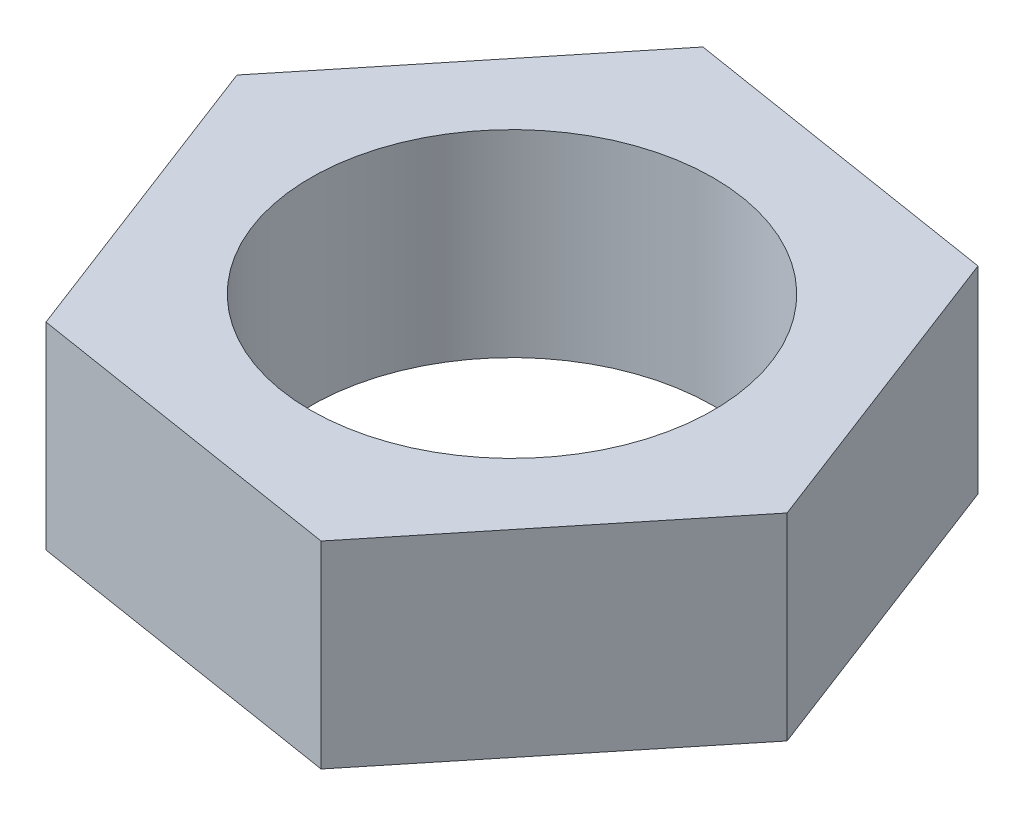
ISO-10303-21;
HEADER;
FILE_DESCRIPTION(('STEP AP214'),'2;1');
FILE_NAME('part.step','',(''),(''),'','','');
FILE_SCHEMA(('AUTOMOTIVE_DESIGN { 1 0 10303 214 1 1 1 1 }'));
ENDSEC;
DATA;
#1=APPLICATION_CONTEXT('core data for automotive mechanical design processes');
#2=APPLICATION_PROTOCOL_DEFINITION('international standard','automotive_design',2000,#1);
#3=PRODUCT_CONTEXT('',#1,'mechanical');
#4=PRODUCT('Part','Part','',(#3));
#5=PRODUCT_RELATED_PRODUCT_CATEGORY('part','',(#4));
#6=PRODUCT_DEFINITION_FORMATION('','',#4);
#7=PRODUCT_DEFINITION_CONTEXT('part definition',#1,'design');
#8=PRODUCT_DEFINITION('design','',#6,#7);
#9=PRODUCT_DEFINITION_SHAPE('','',#8);
#10=(LENGTH_UNIT() NAMED_UNIT(*) SI_UNIT(.MILLI.,.METRE.));
#11=(NAMED_UNIT(*) PLANE_ANGLE_UNIT() SI_UNIT($,.RADIAN.));
#12=(NAMED_UNIT(*) SI_UNIT($,.STERADIAN.) SOLID_ANGLE_UNIT());
#13=UNCERTAINTY_MEASURE_WITH_UNIT(LENGTH_MEASURE(1.E-05),#10,'distance_accuracy_value','');
#14=(GEOMETRIC_REPRESENTATION_CONTEXT(3) GLOBAL_UNCERTAINTY_ASSIGNED_CONTEXT((#13)) GLOBAL_UNIT_ASSIGNED_CONTEXT((#10,
#11,#12)) REPRESENTATION_CONTEXT('',''));
#15=CARTESIAN_POINT('',(0.,0.,0.));
#16=DIRECTION('',(0.,0.,1.));
#17=DIRECTION('',(1.,0.,0.));
#18=AXIS2_PLACEMENT_3D('',#15,#16,#17);
#19=CARTESIAN_POINT('',(-52.8507311245099,50.,65.1538672591704));
#20=DIRECTION('',(0.157259406042697,0.,-0.987557329581983));
#21=DIRECTION('',(-0.987557329581983,0.,-0.157259406042697));
#22=AXIS2_PLACEMENT_3D('',#19,#20,#21);
#23=PLANE('',#22);
#24=DIRECTION('',(0.987557329581983,0.,0.157259406042697));
#25=VECTOR('',#24,1.);
#26=CARTESIAN_POINT('',(-52.8507311245099,0.,65.1538672591704));
#27=LINE('',#26,#25);
#28=CARTESIAN_POINT('',(-52.8507311245099,0.,65.1538672591704));
#29=VERTEX_POINT('',#28);
#30=CARTESIAN_POINT('',(29.9995386389858,0.,78.3470093919917));
#31=VERTEX_POINT('',#30);
#32=EDGE_CURVE('E128',#29,#31,#27,.T.);
#33=ORIENTED_EDGE('',*,*,#32,.T.);
#34=DIRECTION('',(0.,-1.,0.));
#35=VECTOR('',#34,1.);
#36=CARTESIAN_POINT('',(29.9995386389858,50.,78.3470093919917));
#37=LINE('',#36,#35);
#38=CARTESIAN_POINT('',(29.9995386389858,50.,78.3470093919917));
#39=VERTEX_POINT('',#38);
#40=EDGE_CURVE('E11',#39,#31,#37,.T.);
#41=ORIENTED_EDGE('',*,*,#40,.F.);
#42=DIRECTION('',(0.987557329581983,0.,0.157259406042697));
#43=VECTOR('',#42,1.);
#44=CARTESIAN_POINT('',(-52.8507311245099,50.,65.1538672591704));
#45=LINE('',#44,#43);
#46=CARTESIAN_POINT('',(-52.8507311245099,50.,65.1538672591704));
#47=VERTEX_POINT('',#46);
#48=EDGE_CURVE('E145',#47,#39,#45,.T.);
#49=ORIENTED_EDGE('',*,*,#48,.F.);
#50=DIRECTION('',(0.,-1.,0.));
#51=VECTOR('',#50,1.);
#52=CARTESIAN_POINT('',(-52.8507311245099,50.,65.1538672591704));
#53=LINE('',#52,#51);
#54=EDGE_CURVE('E124',#47,#29,#53,.T.);
#55=ORIENTED_EDGE('',*,*,#54,.T.);
#56=EDGE_LOOP('',(#33,#41,#49,#55));
#57=FACE_BOUND('',#56,.T.);
#58=ADVANCED_FACE('F39',(#57),#23,.F.);
#59=CARTESIAN_POINT('',(29.9995386389858,50.,78.3470093919917));
#60=DIRECTION('',(-0.776620032090171,0.,-0.629969305408019));
#61=DIRECTION('',(-0.629969305408019,0.,0.776620032090171));
#62=AXIS2_PLACEMENT_3D('',#59,#60,#61);
#63=PLANE('',#62);
#64=DIRECTION('',(0.629969305408019,0.,-0.776620032090171));
#65=VECTOR('',#64,1.);
#66=CARTESIAN_POINT('',(29.9995386389858,0.,78.3470093919917));
#67=LINE('',#66,#65);
#68=CARTESIAN_POINT('',(82.8502697634957,0.,13.1931421328213));
#69=VERTEX_POINT('',#68);
#70=EDGE_CURVE('E132',#31,#69,#67,.T.);
#71=ORIENTED_EDGE('',*,*,#70,.T.);
#72=DIRECTION('',(0.,-1.,0.));
#73=VECTOR('',#72,1.);
#74=CARTESIAN_POINT('',(82.8502697634957,50.,13.1931421328213));
#75=LINE('',#74,#73);
#76=CARTESIAN_POINT('',(82.8502697634957,50.,13.1931421328213));
#77=VERTEX_POINT('',#76);
#78=EDGE_CURVE('E48',#77,#69,#75,.T.);
#79=ORIENTED_EDGE('',*,*,#78,.F.);
#80=DIRECTION('',(0.629969305408019,0.,-0.776620032090171));
#81=VECTOR('',#80,1.);
#82=CARTESIAN_POINT('',(29.9995386389858,50.,78.3470093919917));
#83=LINE('',#82,#81);
#84=EDGE_CURVE('E93',#39,#77,#83,.T.);
#85=ORIENTED_EDGE('',*,*,#84,.F.);
#86=ORIENTED_EDGE('',*,*,#40,.T.);
#87=EDGE_LOOP('',(#71,#79,#85,#86));
#88=FACE_BOUND('',#87,.T.);
#89=ADVANCED_FACE('F174',(#88),#63,.F.);
#90=CARTESIAN_POINT('',(82.8502697634957,50.,13.1931421328213));
#91=DIRECTION('',(-0.933879438132868,0.,0.357588024173964));
#92=DIRECTION('',(0.357588024173964,0.,0.933879438132868));
#93=AXIS2_PLACEMENT_3D('',#90,#91,#92);
#94=PLANE('',#93);
#95=DIRECTION('',(-0.357588024173964,0.,-0.933879438132867));
#96=VECTOR('',#95,1.);
#97=CARTESIAN_POINT('',(82.8502697634957,0.,13.1931421328213));
#98=LINE('',#97,#96);
#99=CARTESIAN_POINT('',(52.8507311245099,0.,-65.1538672591704));
#100=VERTEX_POINT('',#99);
#101=EDGE_CURVE('E136',#69,#100,#98,.T.);
#102=ORIENTED_EDGE('',*,*,#101,.T.);
#103=DIRECTION('',(0.,-1.,0.));
#104=VECTOR('',#103,1.);
#105=CARTESIAN_POINT('',(52.8507311245099,50.,-65.1538672591704));
#106=LINE('',#105,#104);
#107=CARTESIAN_POINT('',(52.8507311245099,50.,-65.1538672591704));
#108=VERTEX_POINT('',#107);
#109=EDGE_CURVE('E117',#108,#100,#106,.T.);
#110=ORIENTED_EDGE('',*,*,#109,.F.);
#111=DIRECTION('',(-0.357588024173964,0.,-0.933879438132867));
#112=VECTOR('',#111,1.);
#113=CARTESIAN_POINT('',(82.8502697634957,50.,13.1931421328213));
#114=LINE('',#113,#112);
#115=EDGE_CURVE('E106',#77,#108,#114,.T.);
#116=ORIENTED_EDGE('',*,*,#115,.F.);
#117=ORIENTED_EDGE('',*,*,#78,.T.);
#118=EDGE_LOOP('',(#102,#110,#116,#117));
#119=FACE_BOUND('',#118,.T.);
#120=ADVANCED_FACE('F155',(#119),#94,.F.);
#121=CARTESIAN_POINT('',(52.8507311245099,50.,-65.1538672591704));
#122=DIRECTION('',(-0.157259406042697,0.,0.987557329581983));
#123=DIRECTION('',(0.987557329581983,0.,0.157259406042697));
#124=AXIS2_PLACEMENT_3D('',#121,#122,#123);
#125=PLANE('',#124);
#126=DIRECTION('',(-0.987557329581983,0.,-0.157259406042697));
#127=VECTOR('',#126,1.);
#128=CARTESIAN_POINT('',(52.8507311245099,0.,-65.1538672591704));
#129=LINE('',#128,#127);
#130=CARTESIAN_POINT('',(-29.9995386389858,0.,-78.3470093919917));
#131=VERTEX_POINT('',#130);
#132=EDGE_CURVE('E115',#100,#131,#129,.T.);
#133=ORIENTED_EDGE('',*,*,#132,.T.);
#134=DIRECTION('',(0.,-1.,0.));
#135=VECTOR('',#134,1.);
#136=CARTESIAN_POINT('',(-29.9995386389858,50.,-78.3470093919917));
#137=LINE('',#136,#135);
#138=CARTESIAN_POINT('',(-29.9995386389858,50.,-78.3470093919917));
#139=VERTEX_POINT('',#138);
#140=EDGE_CURVE('E112',#139,#131,#137,.T.);
#141=ORIENTED_EDGE('',*,*,#140,.F.);
#142=DIRECTION('',(-0.987557329581983,0.,-0.157259406042697));
#143=VECTOR('',#142,1.);
#144=CARTESIAN_POINT('',(52.8507311245099,50.,-65.1538672591704));
#145=LINE('',#144,#143);
#146=EDGE_CURVE('E100',#108,#139,#145,.T.);
#147=ORIENTED_EDGE('',*,*,#146,.F.);
#148=ORIENTED_EDGE('',*,*,#109,.T.);
#149=EDGE_LOOP('',(#133,#141,#147,#148));
#150=FACE_BOUND('',#149,.T.);
#151=ADVANCED_FACE('F113',(#150),#125,.F.);
#152=CARTESIAN_POINT('',(-29.9995386389858,50.,-78.3470093919917));
#153=DIRECTION('',(0.776620032090171,0.,0.629969305408019));
#154=DIRECTION('',(0.629969305408019,0.,-0.776620032090171));
#155=AXIS2_PLACEMENT_3D('',#152,#153,#154);
#156=PLANE('',#155);
#157=DIRECTION('',(-0.629969305408019,0.,0.776620032090171));
#158=VECTOR('',#157,1.);
#159=CARTESIAN_POINT('',(-29.9995386389858,0.,-78.3470093919917));
#160=LINE('',#159,#158);
#161=CARTESIAN_POINT('',(-82.8502697634957,0.,-13.1931421328213));
#162=VERTEX_POINT('',#161);
#163=EDGE_CURVE('E79',#131,#162,#160,.T.);
#164=ORIENTED_EDGE('',*,*,#163,.T.);
#165=DIRECTION('',(0.,-1.,0.));
#166=VECTOR('',#165,1.);
#167=CARTESIAN_POINT('',(-82.8502697634957,50.,-13.1931421328213));
#168=LINE('',#167,#166);
#169=CARTESIAN_POINT('',(-82.8502697634957,50.,-13.1931421328213));
#170=VERTEX_POINT('',#169);
#171=EDGE_CURVE('E118',#170,#162,#168,.T.);
#172=ORIENTED_EDGE('',*,*,#171,.F.);
#173=DIRECTION('',(-0.629969305408019,0.,0.776620032090171));
#174=VECTOR('',#173,1.);
#175=CARTESIAN_POINT('',(-29.9995386389858,50.,-78.3470093919917));
#176=LINE('',#175,#174);
#177=EDGE_CURVE('E104',#139,#170,#176,.T.);
#178=ORIENTED_EDGE('',*,*,#177,.F.);
#179=ORIENTED_EDGE('',*,*,#140,.T.);
#180=EDGE_LOOP('',(#164,#172,#178,#179));
#181=FACE_BOUND('',#180,.T.);
#182=ADVANCED_FACE('F120',(#181),#156,.F.);
#183=CARTESIAN_POINT('',(-82.8502697634957,50.,-13.1931421328213));
#184=DIRECTION('',(0.933879438132868,0.,-0.357588024173964));
#185=DIRECTION('',(-0.357588024173964,0.,-0.933879438132868));
#186=AXIS2_PLACEMENT_3D('',#183,#184,#185);
#187=PLANE('',#186);
#188=DIRECTION('',(0.357588024173964,0.,0.933879438132867));
#189=VECTOR('',#188,1.);
#190=CARTESIAN_POINT('',(-82.8502697634957,0.,-13.1931421328213));
#191=LINE('',#190,#189);
#192=EDGE_CURVE('E85',#162,#29,#191,.T.);
#193=ORIENTED_EDGE('',*,*,#192,.T.);
#194=ORIENTED_EDGE('',*,*,#54,.F.);
#195=DIRECTION('',(0.357588024173964,0.,0.933879438132867));
#196=VECTOR('',#195,1.);
#197=CARTESIAN_POINT('',(-82.8502697634957,50.,-13.1931421328213));
#198=LINE('',#197,#196);
#199=EDGE_CURVE('E56',#170,#47,#198,.T.);
#200=ORIENTED_EDGE('',*,*,#199,.F.);
#201=ORIENTED_EDGE('',*,*,#171,.T.);
#202=EDGE_LOOP('',(#193,#194,#200,#201));
#203=FACE_BOUND('',#202,.T.);
#204=ADVANCED_FACE('F162',(#203),#187,.F.);
#205=CARTESIAN_POINT('',(0.,50.,0.));
#206=DIRECTION('',(0.,1.,0.));
#207=DIRECTION('',(0.,0.,1.));
#208=AXIS2_PLACEMENT_3D('',#205,#206,#207);
#209=PLANE('',#208);
#210=CARTESIAN_POINT('',(0.,50.,0.));
#211=DIRECTION('',(0.,1.,0.));
#212=DIRECTION('',(0.,0.,1.));
#213=AXIS2_PLACEMENT_3D('',#210,#211,#212);
#214=CIRCLE('',#213,50.9893919824888);
#215=CARTESIAN_POINT('',(0.,50.,50.9893919824888));
#216=VERTEX_POINT('',#215);
#217=EDGE_CURVE('E229',#216,#216,#214,.T.);
#218=ORIENTED_EDGE('',*,*,#217,.F.);
#219=EDGE_LOOP('',(#218));
#220=FACE_BOUND('',#219,.T.);
#221=ORIENTED_EDGE('',*,*,#48,.T.);
#222=ORIENTED_EDGE('',*,*,#84,.T.);
#223=ORIENTED_EDGE('',*,*,#115,.T.);
#224=ORIENTED_EDGE('',*,*,#146,.T.);
#225=ORIENTED_EDGE('',*,*,#177,.T.);
#226=ORIENTED_EDGE('',*,*,#199,.T.);
#227=EDGE_LOOP('',(#221,#222,#223,#224,#225,#226));
#228=FACE_BOUND('',#227,.T.);
#229=ADVANCED_FACE('F102',(#220,#228),#209,.T.);
#230=CARTESIAN_POINT('',(0.,0.,0.));
#231=DIRECTION('',(0.,1.,0.));
#232=DIRECTION('',(0.,0.,1.));
#233=AXIS2_PLACEMENT_3D('',#230,#231,#232);
#234=PLANE('',#233);
#235=CARTESIAN_POINT('',(0.,0.,0.));
#236=DIRECTION('',(0.,1.,0.));
#237=DIRECTION('',(0.,0.,1.));
#238=AXIS2_PLACEMENT_3D('',#235,#236,#237);
#239=CIRCLE('',#238,50.9893919824888);
#240=CARTESIAN_POINT('',(0.,0.,50.9893919824888));
#241=VERTEX_POINT('',#240);
#242=EDGE_CURVE('E133',#241,#241,#239,.T.);
#243=ORIENTED_EDGE('',*,*,#242,.T.);
#244=EDGE_LOOP('',(#243));
#245=FACE_BOUND('',#244,.T.);
#246=ORIENTED_EDGE('',*,*,#32,.F.);
#247=ORIENTED_EDGE('',*,*,#192,.F.);
#248=ORIENTED_EDGE('',*,*,#163,.F.);
#249=ORIENTED_EDGE('',*,*,#132,.F.);
#250=ORIENTED_EDGE('',*,*,#101,.F.);
#251=ORIENTED_EDGE('',*,*,#70,.F.);
#252=EDGE_LOOP('',(#246,#247,#248,#249,#250,#251));
#253=FACE_BOUND('',#252,.T.);
#254=ADVANCED_FACE('F158',(#245,#253),#234,.F.);
#255=CARTESIAN_POINT('',(0.,0.,0.));
#256=DIRECTION('',(0.,1.,0.));
#257=DIRECTION('',(0.,0.,1.));
#258=AXIS2_PLACEMENT_3D('',#255,#256,#257);
#259=CYLINDRICAL_SURFACE('',#258,50.9893919824888);
#260=ORIENTED_EDGE('',*,*,#242,.F.);
#261=EDGE_LOOP('',(#260));
#262=FACE_BOUND('',#261,.T.);
#263=ORIENTED_EDGE('',*,*,#217,.T.);
#264=EDGE_LOOP('',(#263));
#265=FACE_BOUND('',#264,.T.);
#266=ADVANCED_FACE('F211',(#262,#265),#259,.F.);
#267=CLOSED_SHELL('',(#58,#89,#120,#151,#182,#204,#229,#254,#266));
#268=MANIFOLD_SOLID_BREP('B2',#267);
#269=ADVANCED_BREP_SHAPE_REPRESENTATION('',(#18,#268),#14);
#270=SHAPE_DEFINITION_REPRESENTATION(#9,#269);
ENDSEC;
END-ISO-10303-21;
